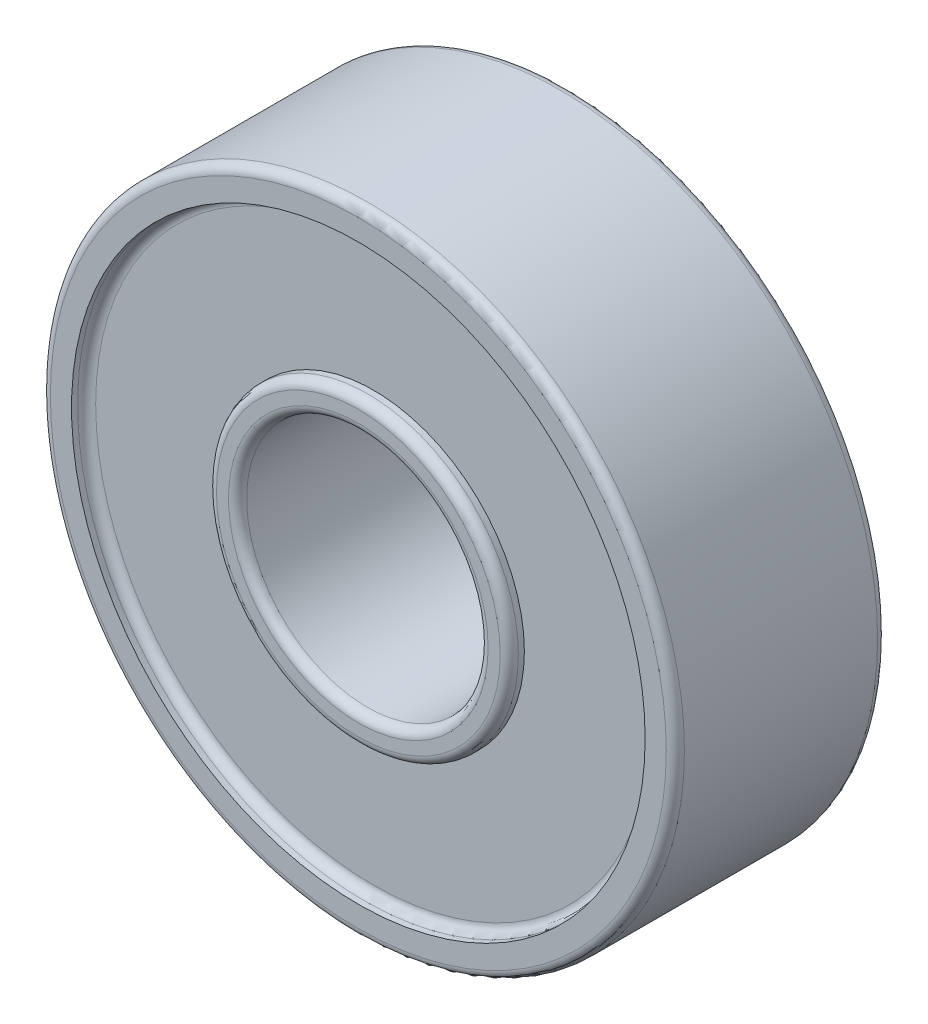
ISO-10303-21;
HEADER;
FILE_DESCRIPTION(('STEP AP214'),'2;1');
FILE_NAME('part.step','',(''),(''),'','','');
FILE_SCHEMA(('AUTOMOTIVE_DESIGN { 1 0 10303 214 1 1 1 1 }'));
ENDSEC;
DATA;
#1=APPLICATION_CONTEXT('core data for automotive mechanical design processes');
#2=APPLICATION_PROTOCOL_DEFINITION('international standard','automotive_design',2000,#1);
#3=PRODUCT_CONTEXT('',#1,'mechanical');
#4=PRODUCT('Part','Part','',(#3));
#5=PRODUCT_RELATED_PRODUCT_CATEGORY('part','',(#4));
#6=PRODUCT_DEFINITION_FORMATION('','',#4);
#7=PRODUCT_DEFINITION_CONTEXT('part definition',#1,'design');
#8=PRODUCT_DEFINITION('design','',#6,#7);
#9=PRODUCT_DEFINITION_SHAPE('','',#8);
#10=(LENGTH_UNIT() NAMED_UNIT(*) SI_UNIT(.MILLI.,.METRE.));
#11=(NAMED_UNIT(*) PLANE_ANGLE_UNIT() SI_UNIT($,.RADIAN.));
#12=(NAMED_UNIT(*) SI_UNIT($,.STERADIAN.) SOLID_ANGLE_UNIT());
#13=UNCERTAINTY_MEASURE_WITH_UNIT(LENGTH_MEASURE(1.E-05),#10,'distance_accuracy_value','');
#14=(GEOMETRIC_REPRESENTATION_CONTEXT(3) GLOBAL_UNCERTAINTY_ASSIGNED_CONTEXT((#13)) GLOBAL_UNIT_ASSIGNED_CONTEXT((#10,
#11,#12)) REPRESENTATION_CONTEXT('',''));
#15=CARTESIAN_POINT('',(0.,0.,0.));
#16=DIRECTION('',(0.,0.,1.));
#17=DIRECTION('',(1.,0.,0.));
#18=AXIS2_PLACEMENT_3D('',#15,#16,#17);
#19=CARTESIAN_POINT('',(0.,0.,7.));
#20=DIRECTION('',(0.,0.,-1.));
#21=DIRECTION('',(-1.,0.,0.));
#22=AXIS2_PLACEMENT_3D('',#19,#20,#21);
#23=CYLINDRICAL_SURFACE('',#22,5.);
#24=CARTESIAN_POINT('',(0.,0.,0.3));
#25=DIRECTION('',(0.,0.,1.));
#26=DIRECTION('',(1.,0.,0.));
#27=AXIS2_PLACEMENT_3D('',#24,#25,#26);
#28=CIRCLE('',#27,5.);
#29=CARTESIAN_POINT('',(5.,0.,0.3));
#30=VERTEX_POINT('',#29);
#31=EDGE_CURVE('E76',#30,#30,#28,.T.);
#32=ORIENTED_EDGE('',*,*,#31,.T.);
#33=EDGE_LOOP('',(#32));
#34=FACE_BOUND('',#33,.T.);
#35=CARTESIAN_POINT('',(0.,0.,0.5));
#36=DIRECTION('',(0.,0.,1.));
#37=DIRECTION('',(1.,0.,0.));
#38=AXIS2_PLACEMENT_3D('',#35,#36,#37);
#39=CIRCLE('',#38,5.);
#40=CARTESIAN_POINT('',(5.,0.,0.5));
#41=VERTEX_POINT('',#40);
#42=EDGE_CURVE('E97',#41,#41,#39,.T.);
#43=ORIENTED_EDGE('',*,*,#42,.F.);
#44=EDGE_LOOP('',(#43));
#45=FACE_BOUND('',#44,.T.);
#46=ADVANCED_FACE('F41',(#34,#45),#23,.T.);
#47=CARTESIAN_POINT('',(0.,0.,7.));
#48=DIRECTION('',(0.,0.,1.));
#49=DIRECTION('',(1.,0.,0.));
#50=AXIS2_PLACEMENT_3D('',#47,#48,#49);
#51=PLANE('',#50);
#52=CARTESIAN_POINT('',(0.,0.,7.));
#53=DIRECTION('',(0.,0.,1.));
#54=DIRECTION('',(1.,0.,0.));
#55=AXIS2_PLACEMENT_3D('',#52,#53,#54);
#56=CIRCLE('',#55,4.3);
#57=CARTESIAN_POINT('',(4.3,0.,7.));
#58=VERTEX_POINT('',#57);
#59=EDGE_CURVE('E79',#58,#58,#56,.F.);
#60=ORIENTED_EDGE('',*,*,#59,.T.);
#61=EDGE_LOOP('',(#60));
#62=FACE_BOUND('',#61,.T.);
#63=CARTESIAN_POINT('',(0.,0.,7.));
#64=DIRECTION('',(0.,0.,1.));
#65=DIRECTION('',(1.,0.,0.));
#66=AXIS2_PLACEMENT_3D('',#63,#64,#65);
#67=CIRCLE('',#66,4.7);
#68=CARTESIAN_POINT('',(4.7,0.,7.));
#69=VERTEX_POINT('',#68);
#70=EDGE_CURVE('E82',#69,#69,#67,.T.);
#71=ORIENTED_EDGE('',*,*,#70,.T.);
#72=EDGE_LOOP('',(#71));
#73=FACE_BOUND('',#72,.T.);
#74=ADVANCED_FACE('F129',(#62,#73),#51,.T.);
#75=CARTESIAN_POINT('',(0.,0.,0.));
#76=DIRECTION('',(0.,0.,1.));
#77=DIRECTION('',(1.,0.,0.));
#78=AXIS2_PLACEMENT_3D('',#75,#76,#77);
#79=PLANE('',#78);
#80=CARTESIAN_POINT('',(0.,0.,0.));
#81=DIRECTION('',(0.,0.,1.));
#82=DIRECTION('',(1.,0.,0.));
#83=AXIS2_PLACEMENT_3D('',#80,#81,#82);
#84=CIRCLE('',#83,4.3);
#85=CARTESIAN_POINT('',(4.3,0.,0.));
#86=VERTEX_POINT('',#85);
#87=EDGE_CURVE('E91',#86,#86,#84,.T.);
#88=ORIENTED_EDGE('',*,*,#87,.T.);
#89=EDGE_LOOP('',(#88));
#90=FACE_BOUND('',#89,.T.);
#91=CARTESIAN_POINT('',(0.,0.,0.));
#92=DIRECTION('',(0.,0.,1.));
#93=DIRECTION('',(1.,0.,0.));
#94=AXIS2_PLACEMENT_3D('',#91,#92,#93);
#95=CIRCLE('',#94,4.7);
#96=CARTESIAN_POINT('',(4.7,0.,0.));
#97=VERTEX_POINT('',#96);
#98=EDGE_CURVE('E94',#97,#97,#95,.F.);
#99=ORIENTED_EDGE('',*,*,#98,.T.);
#100=EDGE_LOOP('',(#99));
#101=FACE_BOUND('',#100,.T.);
#102=ADVANCED_FACE('F137',(#90,#101),#79,.F.);
#103=CARTESIAN_POINT('',(0.,0.,6.7));
#104=DIRECTION('',(0.,0.,1.));
#105=DIRECTION('',(1.,0.,0.));
#106=AXIS2_PLACEMENT_3D('',#103,#104,#105);
#107=CIRCLE('',#106,5.);
#108=CARTESIAN_POINT('',(5.,0.,6.7));
#109=VERTEX_POINT('',#108);
#110=EDGE_CURVE('E73',#109,#109,#107,.F.);
#111=ORIENTED_EDGE('',*,*,#110,.T.);
#112=EDGE_LOOP('',(#111));
#113=FACE_BOUND('',#112,.T.);
#114=CARTESIAN_POINT('',(0.,0.,6.5));
#115=DIRECTION('',(0.,0.,1.));
#116=DIRECTION('',(1.,0.,0.));
#117=AXIS2_PLACEMENT_3D('',#114,#115,#116);
#118=CIRCLE('',#117,5.);
#119=CARTESIAN_POINT('',(5.,0.,6.5));
#120=VERTEX_POINT('',#119);
#121=EDGE_CURVE('E103',#120,#120,#118,.T.);
#122=ORIENTED_EDGE('',*,*,#121,.T.);
#123=EDGE_LOOP('',(#122));
#124=FACE_BOUND('',#123,.T.);
#125=ADVANCED_FACE('F132',(#113,#124),#23,.T.);
#126=CARTESIAN_POINT('',(0.,0.,7.));
#127=DIRECTION('',(0.,0.,-1.));
#128=DIRECTION('',(-1.,0.,0.));
#129=AXIS2_PLACEMENT_3D('',#126,#127,#128);
#130=CYLINDRICAL_SURFACE('',#129,4.);
#131=CARTESIAN_POINT('',(0.,0.,0.3));
#132=DIRECTION('',(0.,0.,1.));
#133=DIRECTION('',(1.,0.,0.));
#134=AXIS2_PLACEMENT_3D('',#131,#132,#133);
#135=CIRCLE('',#134,4.);
#136=CARTESIAN_POINT('',(4.,0.,0.3));
#137=VERTEX_POINT('',#136);
#138=EDGE_CURVE('E85',#137,#137,#135,.F.);
#139=ORIENTED_EDGE('',*,*,#138,.T.);
#140=EDGE_LOOP('',(#139));
#141=FACE_BOUND('',#140,.T.);
#142=CARTESIAN_POINT('',(0.,0.,6.7));
#143=DIRECTION('',(0.,0.,1.));
#144=DIRECTION('',(1.,0.,0.));
#145=AXIS2_PLACEMENT_3D('',#142,#143,#144);
#146=CIRCLE('',#145,4.);
#147=CARTESIAN_POINT('',(4.,0.,6.7));
#148=VERTEX_POINT('',#147);
#149=EDGE_CURVE('E88',#148,#148,#146,.T.);
#150=ORIENTED_EDGE('',*,*,#149,.T.);
#151=EDGE_LOOP('',(#150));
#152=FACE_BOUND('',#151,.T.);
#153=ADVANCED_FACE('F144',(#141,#152),#130,.F.);
#154=CARTESIAN_POINT('',(0.,0.,0.5));
#155=DIRECTION('',(0.,0.,1.));
#156=DIRECTION('',(1.,0.,0.));
#157=AXIS2_PLACEMENT_3D('',#154,#155,#156);
#158=PLANE('',#157);
#159=ORIENTED_EDGE('',*,*,#42,.T.);
#160=EDGE_LOOP('',(#159));
#161=FACE_BOUND('',#160,.T.);
#162=CARTESIAN_POINT('',(0.,0.,0.5));
#163=DIRECTION('',(0.,0.,1.));
#164=DIRECTION('',(1.,0.,0.));
#165=AXIS2_PLACEMENT_3D('',#162,#163,#164);
#166=CIRCLE('',#165,9.5);
#167=CARTESIAN_POINT('',(9.5,0.,0.5));
#168=VERTEX_POINT('',#167);
#169=EDGE_CURVE('E100',#168,#168,#166,.T.);
#170=ORIENTED_EDGE('',*,*,#169,.F.);
#171=EDGE_LOOP('',(#170));
#172=FACE_BOUND('',#171,.T.);
#173=ADVANCED_FACE('F150',(#161,#172),#158,.F.);
#174=CARTESIAN_POINT('',(0.,0.,6.5));
#175=DIRECTION('',(0.,0.,1.));
#176=DIRECTION('',(1.,0.,0.));
#177=AXIS2_PLACEMENT_3D('',#174,#175,#176);
#178=PLANE('',#177);
#179=CARTESIAN_POINT('',(0.,0.,6.5));
#180=DIRECTION('',(0.,0.,1.));
#181=DIRECTION('',(1.,0.,0.));
#182=AXIS2_PLACEMENT_3D('',#179,#180,#181);
#183=CIRCLE('',#182,9.2);
#184=CARTESIAN_POINT('',(9.2,0.,6.5));
#185=VERTEX_POINT('',#184);
#186=EDGE_CURVE('E70',#185,#185,#183,.T.);
#187=ORIENTED_EDGE('',*,*,#186,.T.);
#188=EDGE_LOOP('',(#187));
#189=FACE_BOUND('',#188,.T.);
#190=ORIENTED_EDGE('',*,*,#121,.F.);
#191=EDGE_LOOP('',(#190));
#192=FACE_BOUND('',#191,.T.);
#193=ADVANCED_FACE('F158',(#189,#192),#178,.T.);
#194=CARTESIAN_POINT('',(0.,0.,0.));
#195=DIRECTION('',(0.,0.,1.));
#196=DIRECTION('',(1.,0.,0.));
#197=AXIS2_PLACEMENT_3D('',#194,#195,#196);
#198=CYLINDRICAL_SURFACE('',#197,9.5);
#199=CARTESIAN_POINT('',(0.,0.,0.3));
#200=DIRECTION('',(0.,0.,1.));
#201=DIRECTION('',(1.,0.,0.));
#202=AXIS2_PLACEMENT_3D('',#199,#200,#201);
#203=CIRCLE('',#202,9.5);
#204=CARTESIAN_POINT('',(9.5,0.,0.3));
#205=VERTEX_POINT('',#204);
#206=EDGE_CURVE('E10',#205,#205,#203,.F.);
#207=ORIENTED_EDGE('',*,*,#206,.T.);
#208=EDGE_LOOP('',(#207));
#209=FACE_BOUND('',#208,.T.);
#210=ORIENTED_EDGE('',*,*,#169,.T.);
#211=EDGE_LOOP('',(#210));
#212=FACE_BOUND('',#211,.T.);
#213=ADVANCED_FACE('F124',(#209,#212),#198,.F.);
#214=CARTESIAN_POINT('',(0.,0.,0.));
#215=DIRECTION('',(0.,0.,1.));
#216=DIRECTION('',(1.,0.,0.));
#217=AXIS2_PLACEMENT_3D('',#214,#215,#216);
#218=CYLINDRICAL_SURFACE('',#217,10.5);
#219=CARTESIAN_POINT('',(0.,0.,6.7));
#220=DIRECTION('',(0.,0.,1.));
#221=DIRECTION('',(1.,0.,0.));
#222=AXIS2_PLACEMENT_3D('',#219,#220,#221);
#223=CIRCLE('',#222,10.5);
#224=CARTESIAN_POINT('',(10.5,0.,6.7));
#225=VERTEX_POINT('',#224);
#226=EDGE_CURVE('E56',#225,#225,#223,.F.);
#227=ORIENTED_EDGE('',*,*,#226,.T.);
#228=EDGE_LOOP('',(#227));
#229=FACE_BOUND('',#228,.T.);
#230=CARTESIAN_POINT('',(0.,0.,0.3));
#231=DIRECTION('',(0.,0.,1.));
#232=DIRECTION('',(1.,0.,0.));
#233=AXIS2_PLACEMENT_3D('',#230,#231,#232);
#234=CIRCLE('',#233,10.5);
#235=CARTESIAN_POINT('',(10.5,0.,0.3));
#236=VERTEX_POINT('',#235);
#237=EDGE_CURVE('E61',#236,#236,#234,.T.);
#238=ORIENTED_EDGE('',*,*,#237,.T.);
#239=EDGE_LOOP('',(#238));
#240=FACE_BOUND('',#239,.T.);
#241=ADVANCED_FACE('F125',(#229,#240),#218,.T.);
#242=CARTESIAN_POINT('',(0.,0.,0.));
#243=DIRECTION('',(0.,0.,1.));
#244=DIRECTION('',(1.,0.,0.));
#245=AXIS2_PLACEMENT_3D('',#242,#243,#244);
#246=PLANE('',#245);
#247=CARTESIAN_POINT('',(0.,0.,0.));
#248=DIRECTION('',(0.,0.,1.));
#249=DIRECTION('',(1.,0.,0.));
#250=AXIS2_PLACEMENT_3D('',#247,#248,#249);
#251=CIRCLE('',#250,9.8);
#252=CARTESIAN_POINT('',(9.8,0.,0.));
#253=VERTEX_POINT('',#252);
#254=EDGE_CURVE('E48',#253,#253,#251,.T.);
#255=ORIENTED_EDGE('',*,*,#254,.T.);
#256=EDGE_LOOP('',(#255));
#257=FACE_BOUND('',#256,.T.);
#258=CARTESIAN_POINT('',(0.,0.,0.));
#259=DIRECTION('',(0.,0.,1.));
#260=DIRECTION('',(1.,0.,0.));
#261=AXIS2_PLACEMENT_3D('',#258,#259,#260);
#262=CIRCLE('',#261,10.2);
#263=CARTESIAN_POINT('',(10.2,0.,0.));
#264=VERTEX_POINT('',#263);
#265=EDGE_CURVE('E52',#264,#264,#262,.F.);
#266=ORIENTED_EDGE('',*,*,#265,.T.);
#267=EDGE_LOOP('',(#266));
#268=FACE_BOUND('',#267,.T.);
#269=ADVANCED_FACE('F114',(#257,#268),#246,.F.);
#270=CARTESIAN_POINT('',(0.,0.,7.));
#271=DIRECTION('',(0.,0.,1.));
#272=DIRECTION('',(1.,0.,0.));
#273=AXIS2_PLACEMENT_3D('',#270,#271,#272);
#274=PLANE('',#273);
#275=CARTESIAN_POINT('',(0.,0.,7.));
#276=DIRECTION('',(0.,0.,1.));
#277=DIRECTION('',(1.,0.,0.));
#278=AXIS2_PLACEMENT_3D('',#275,#276,#277);
#279=CIRCLE('',#278,10.2);
#280=CARTESIAN_POINT('',(10.2,0.,7.));
#281=VERTEX_POINT('',#280);
#282=EDGE_CURVE('E64',#281,#281,#279,.T.);
#283=ORIENTED_EDGE('',*,*,#282,.T.);
#284=EDGE_LOOP('',(#283));
#285=FACE_BOUND('',#284,.T.);
#286=CARTESIAN_POINT('',(0.,0.,7.));
#287=DIRECTION('',(0.,0.,1.));
#288=DIRECTION('',(1.,0.,0.));
#289=AXIS2_PLACEMENT_3D('',#286,#287,#288);
#290=CIRCLE('',#289,9.5);
#291=CARTESIAN_POINT('',(9.5,0.,7.));
#292=VERTEX_POINT('',#291);
#293=EDGE_CURVE('E106',#292,#292,#290,.T.);
#294=ORIENTED_EDGE('',*,*,#293,.F.);
#295=EDGE_LOOP('',(#294));
#296=FACE_BOUND('',#295,.T.);
#297=ADVANCED_FACE('F112',(#285,#296),#274,.T.);
#298=CARTESIAN_POINT('',(0.,0.,6.8));
#299=DIRECTION('',(0.,0.,1.));
#300=DIRECTION('',(1.,0.,0.));
#301=AXIS2_PLACEMENT_3D('',#298,#299,#300);
#302=CIRCLE('',#301,9.5);
#303=CARTESIAN_POINT('',(9.5,0.,6.8));
#304=VERTEX_POINT('',#303);
#305=EDGE_CURVE('E67',#304,#304,#302,.F.);
#306=ORIENTED_EDGE('',*,*,#305,.T.);
#307=EDGE_LOOP('',(#306));
#308=FACE_BOUND('',#307,.T.);
#309=ORIENTED_EDGE('',*,*,#293,.T.);
#310=EDGE_LOOP('',(#309));
#311=FACE_BOUND('',#310,.T.);
#312=ADVANCED_FACE('F110',(#308,#311),#198,.F.);
#313=CARTESIAN_POINT('',(0.,0.,0.3));
#314=DIRECTION('',(0.,0.,1.));
#315=DIRECTION('',(1.,0.,0.));
#316=AXIS2_PLACEMENT_3D('',#313,#314,#315);
#317=TOROIDAL_SURFACE('',#316,4.3,0.3);
#318=ORIENTED_EDGE('',*,*,#138,.F.);
#319=EDGE_LOOP('',(#318));
#320=FACE_BOUND('',#319,.T.);
#321=ORIENTED_EDGE('',*,*,#87,.F.);
#322=EDGE_LOOP('',(#321));
#323=FACE_BOUND('',#322,.T.);
#324=ADVANCED_FACE('F121',(#320,#323),#317,.T.);
#325=CARTESIAN_POINT('',(0.,0.,6.7));
#326=DIRECTION('',(0.,0.,1.));
#327=DIRECTION('',(1.,0.,0.));
#328=AXIS2_PLACEMENT_3D('',#325,#326,#327);
#329=TOROIDAL_SURFACE('',#328,4.3,0.3);
#330=ORIENTED_EDGE('',*,*,#59,.F.);
#331=EDGE_LOOP('',(#330));
#332=FACE_BOUND('',#331,.T.);
#333=ORIENTED_EDGE('',*,*,#149,.F.);
#334=EDGE_LOOP('',(#333));
#335=FACE_BOUND('',#334,.T.);
#336=ADVANCED_FACE('F203',(#332,#335),#329,.T.);
#337=CARTESIAN_POINT('',(0.,0.,0.3));
#338=DIRECTION('',(0.,0.,1.));
#339=DIRECTION('',(1.,0.,0.));
#340=AXIS2_PLACEMENT_3D('',#337,#338,#339);
#341=TOROIDAL_SURFACE('',#340,4.7,0.3);
#342=ORIENTED_EDGE('',*,*,#98,.F.);
#343=EDGE_LOOP('',(#342));
#344=FACE_BOUND('',#343,.T.);
#345=ORIENTED_EDGE('',*,*,#31,.F.);
#346=EDGE_LOOP('',(#345));
#347=FACE_BOUND('',#346,.T.);
#348=ADVANCED_FACE('F199',(#344,#347),#341,.T.);
#349=CARTESIAN_POINT('',(0.,0.,6.7));
#350=DIRECTION('',(0.,0.,1.));
#351=DIRECTION('',(1.,0.,0.));
#352=AXIS2_PLACEMENT_3D('',#349,#350,#351);
#353=TOROIDAL_SURFACE('',#352,4.7,0.3);
#354=ORIENTED_EDGE('',*,*,#110,.F.);
#355=EDGE_LOOP('',(#354));
#356=FACE_BOUND('',#355,.T.);
#357=ORIENTED_EDGE('',*,*,#70,.F.);
#358=EDGE_LOOP('',(#357));
#359=FACE_BOUND('',#358,.T.);
#360=ADVANCED_FACE('F195',(#356,#359),#353,.T.);
#361=CARTESIAN_POINT('',(0.,0.,6.8));
#362=DIRECTION('',(0.,0.,1.));
#363=DIRECTION('',(1.,0.,0.));
#364=AXIS2_PLACEMENT_3D('',#361,#362,#363);
#365=TOROIDAL_SURFACE('',#364,9.2,0.3);
#366=ORIENTED_EDGE('',*,*,#305,.F.);
#367=EDGE_LOOP('',(#366));
#368=FACE_BOUND('',#367,.T.);
#369=ORIENTED_EDGE('',*,*,#186,.F.);
#370=EDGE_LOOP('',(#369));
#371=FACE_BOUND('',#370,.T.);
#372=ADVANCED_FACE('F188',(#368,#371),#365,.F.);
#373=CARTESIAN_POINT('',(0.,0.,6.7));
#374=DIRECTION('',(0.,0.,1.));
#375=DIRECTION('',(1.,0.,0.));
#376=AXIS2_PLACEMENT_3D('',#373,#374,#375);
#377=TOROIDAL_SURFACE('',#376,10.2,0.3);
#378=ORIENTED_EDGE('',*,*,#226,.F.);
#379=EDGE_LOOP('',(#378));
#380=FACE_BOUND('',#379,.T.);
#381=ORIENTED_EDGE('',*,*,#282,.F.);
#382=EDGE_LOOP('',(#381));
#383=FACE_BOUND('',#382,.T.);
#384=ADVANCED_FACE('F181',(#380,#383),#377,.T.);
#385=CARTESIAN_POINT('',(0.,0.,0.3));
#386=DIRECTION('',(0.,0.,1.));
#387=DIRECTION('',(1.,0.,0.));
#388=AXIS2_PLACEMENT_3D('',#385,#386,#387);
#389=TOROIDAL_SURFACE('',#388,9.8,0.3);
#390=ORIENTED_EDGE('',*,*,#206,.F.);
#391=EDGE_LOOP('',(#390));
#392=FACE_BOUND('',#391,.T.);
#393=ORIENTED_EDGE('',*,*,#254,.F.);
#394=EDGE_LOOP('',(#393));
#395=FACE_BOUND('',#394,.T.);
#396=ADVANCED_FACE('F176',(#392,#395),#389,.T.);
#397=CARTESIAN_POINT('',(0.,0.,0.3));
#398=DIRECTION('',(0.,0.,1.));
#399=DIRECTION('',(1.,0.,0.));
#400=AXIS2_PLACEMENT_3D('',#397,#398,#399);
#401=TOROIDAL_SURFACE('',#400,10.2,0.3);
#402=ORIENTED_EDGE('',*,*,#265,.F.);
#403=EDGE_LOOP('',(#402));
#404=FACE_BOUND('',#403,.T.);
#405=ORIENTED_EDGE('',*,*,#237,.F.);
#406=EDGE_LOOP('',(#405));
#407=FACE_BOUND('',#406,.T.);
#408=ADVANCED_FACE('F43',(#404,#407),#401,.T.);
#409=CLOSED_SHELL('',(#46,#74,#102,#125,#153,#173,#193,#213,#241,#269,#297,#312,#324,#336,#348,
#360,#372,#384,#396,#408));
#410=MANIFOLD_SOLID_BREP('B2',#409);
#411=ADVANCED_BREP_SHAPE_REPRESENTATION('',(#18,#410),#14);
#412=SHAPE_DEFINITION_REPRESENTATION(#9,#411);
ENDSEC;
END-ISO-10303-21;
